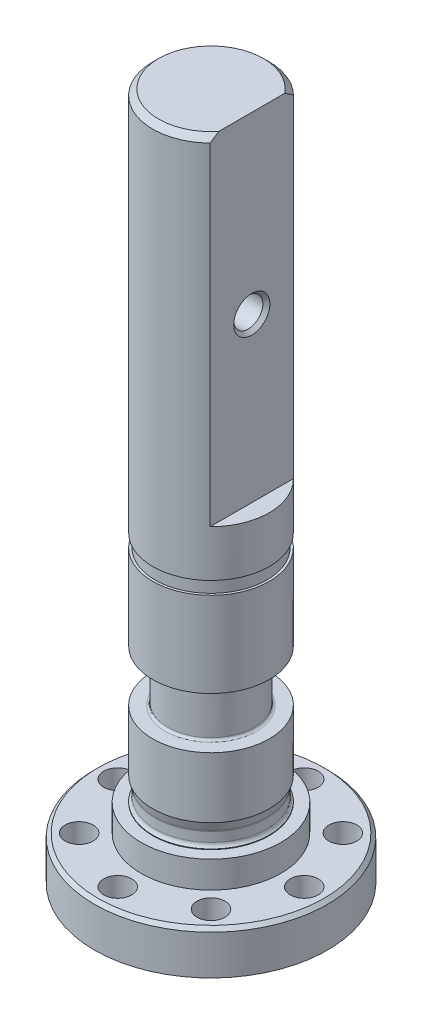
ISO-10303-21;
HEADER;
FILE_DESCRIPTION(('STEP AP214'),'2;1');
FILE_NAME('part.step','',(''),(''),'','','');
FILE_SCHEMA(('AUTOMOTIVE_DESIGN { 1 0 10303 214 1 1 1 1 }'));
ENDSEC;
DATA;
#1=APPLICATION_CONTEXT('core data for automotive mechanical design processes');
#2=APPLICATION_PROTOCOL_DEFINITION('international standard','automotive_design',2000,#1);
#3=PRODUCT_CONTEXT('',#1,'mechanical');
#4=PRODUCT('Part','Part','',(#3));
#5=PRODUCT_RELATED_PRODUCT_CATEGORY('part','',(#4));
#6=PRODUCT_DEFINITION_FORMATION('','',#4);
#7=PRODUCT_DEFINITION_CONTEXT('part definition',#1,'design');
#8=PRODUCT_DEFINITION('design','',#6,#7);
#9=PRODUCT_DEFINITION_SHAPE('','',#8);
#10=(LENGTH_UNIT() NAMED_UNIT(*) SI_UNIT(.MILLI.,.METRE.));
#11=(NAMED_UNIT(*) PLANE_ANGLE_UNIT() SI_UNIT($,.RADIAN.));
#12=(NAMED_UNIT(*) SI_UNIT($,.STERADIAN.) SOLID_ANGLE_UNIT());
#13=UNCERTAINTY_MEASURE_WITH_UNIT(LENGTH_MEASURE(1.E-05),#10,'distance_accuracy_value','');
#14=(GEOMETRIC_REPRESENTATION_CONTEXT(3) GLOBAL_UNCERTAINTY_ASSIGNED_CONTEXT((#13)) GLOBAL_UNIT_ASSIGNED_CONTEXT((#10,
#11,#12)) REPRESENTATION_CONTEXT('',''));
#15=CARTESIAN_POINT('',(0.,0.,0.));
#16=DIRECTION('',(0.,0.,1.));
#17=DIRECTION('',(1.,0.,0.));
#18=AXIS2_PLACEMENT_3D('',#15,#16,#17);
#19=CARTESIAN_POINT('',(0.,59.,0.));
#20=DIRECTION('',(0.,-1.,0.));
#21=DIRECTION('',(0.,0.,-1.));
#22=AXIS2_PLACEMENT_3D('',#19,#20,#21);
#23=CYLINDRICAL_SURFACE('',#22,5.);
#24=CARTESIAN_POINT('',(0.,17.6,0.));
#25=DIRECTION('',(0.,-1.,0.));
#26=DIRECTION('',(0.,0.,-1.));
#27=AXIS2_PLACEMENT_3D('',#24,#25,#26);
#28=CIRCLE('',#27,5.);
#29=CARTESIAN_POINT('',(0.,17.6,-5.));
#30=VERTEX_POINT('',#29);
#31=EDGE_CURVE('E93',#30,#30,#28,.T.);
#32=ORIENTED_EDGE('',*,*,#31,.F.);
#33=EDGE_LOOP('',(#32));
#34=FACE_BOUND('',#33,.T.);
#35=CARTESIAN_POINT('',(0.,24.9,0.));
#36=DIRECTION('',(0.,-1.,0.));
#37=DIRECTION('',(0.,0.,-1.));
#38=AXIS2_PLACEMENT_3D('',#35,#36,#37);
#39=CIRCLE('',#38,5.);
#40=CARTESIAN_POINT('',(0.,24.9,-5.));
#41=VERTEX_POINT('',#40);
#42=EDGE_CURVE('E644',#41,#41,#39,.T.);
#43=ORIENTED_EDGE('',*,*,#42,.T.);
#44=EDGE_LOOP('',(#43));
#45=FACE_BOUND('',#44,.T.);
#46=ADVANCED_FACE('F42',(#34,#45),#23,.T.);
#47=CARTESIAN_POINT('',(0.,8.,0.));
#48=DIRECTION('',(0.,-1.,0.));
#49=DIRECTION('',(0.,0.,-1.));
#50=AXIS2_PLACEMENT_3D('',#47,#48,#49);
#51=CIRCLE('',#50,5.);
#52=CARTESIAN_POINT('',(0.,8.,-5.));
#53=VERTEX_POINT('',#52);
#54=EDGE_CURVE('E119',#53,#53,#51,.T.);
#55=ORIENTED_EDGE('',*,*,#54,.F.);
#56=EDGE_LOOP('',(#55));
#57=FACE_BOUND('',#56,.T.);
#58=CARTESIAN_POINT('',(0.,13.2,0.));
#59=DIRECTION('',(0.,-1.,0.));
#60=DIRECTION('',(0.,0.,-1.));
#61=AXIS2_PLACEMENT_3D('',#58,#59,#60);
#62=CIRCLE('',#61,5.);
#63=CARTESIAN_POINT('',(0.,13.2,-5.));
#64=VERTEX_POINT('',#63);
#65=EDGE_CURVE('E88',#64,#64,#62,.T.);
#66=ORIENTED_EDGE('',*,*,#65,.T.);
#67=EDGE_LOOP('',(#66));
#68=FACE_BOUND('',#67,.T.);
#69=ADVANCED_FACE('F257',(#57,#68),#23,.T.);
#70=CARTESIAN_POINT('',(0.,6.,0.));
#71=DIRECTION('',(0.,1.,0.));
#72=DIRECTION('',(0.,0.,1.));
#73=AXIS2_PLACEMENT_3D('',#70,#71,#72);
#74=CIRCLE('',#73,5.);
#75=CARTESIAN_POINT('',(0.,6.,5.));
#76=VERTEX_POINT('',#75);
#77=EDGE_CURVE('E151',#76,#76,#74,.T.);
#78=ORIENTED_EDGE('',*,*,#77,.T.);
#79=EDGE_LOOP('',(#78));
#80=FACE_BOUND('',#79,.T.);
#81=CARTESIAN_POINT('',(0.,6.05358983848622,0.));
#82=DIRECTION('',(0.,1.,0.));
#83=DIRECTION('',(0.,0.,1.));
#84=AXIS2_PLACEMENT_3D('',#81,#82,#83);
#85=CIRCLE('',#84,5.);
#86=CARTESIAN_POINT('',(0.,6.05358983848622,5.));
#87=VERTEX_POINT('',#86);
#88=EDGE_CURVE('E122',#87,#87,#85,.T.);
#89=ORIENTED_EDGE('',*,*,#88,.F.);
#90=EDGE_LOOP('',(#89));
#91=FACE_BOUND('',#90,.T.);
#92=ADVANCED_FACE('F261',(#80,#91),#23,.T.);
#93=CARTESIAN_POINT('',(0.,6.,0.));
#94=DIRECTION('',(0.,1.,0.));
#95=DIRECTION('',(0.,0.,1.));
#96=AXIS2_PLACEMENT_3D('',#93,#94,#95);
#97=PLANE('',#96);
#98=CARTESIAN_POINT('',(0.,6.,0.));
#99=DIRECTION('',(0.,-1.,0.));
#100=DIRECTION('',(0.,0.,-1.));
#101=AXIS2_PLACEMENT_3D('',#98,#99,#100);
#102=CIRCLE('',#101,6.);
#103=CARTESIAN_POINT('',(0.,6.,-6.));
#104=VERTEX_POINT('',#103);
#105=EDGE_CURVE('E123',#104,#104,#102,.T.);
#106=ORIENTED_EDGE('',*,*,#105,.F.);
#107=EDGE_LOOP('',(#106));
#108=FACE_BOUND('',#107,.T.);
#109=ORIENTED_EDGE('',*,*,#77,.F.);
#110=EDGE_LOOP('',(#109));
#111=FACE_BOUND('',#110,.T.);
#112=ADVANCED_FACE('F250',(#108,#111),#97,.T.);
#113=CARTESIAN_POINT('',(-10.,3.7,0.));
#114=DIRECTION('',(0.,1.,0.));
#115=DIRECTION('',(0.,0.,1.));
#116=AXIS2_PLACEMENT_3D('',#113,#114,#115);
#117=PLANE('',#116);
#118=CARTESIAN_POINT('',(0.,3.7,0.));
#119=DIRECTION('',(0.,1.,0.));
#120=DIRECTION('',(0.,0.,1.));
#121=AXIS2_PLACEMENT_3D('',#118,#119,#120);
#122=CIRCLE('',#121,9.7);
#123=CARTESIAN_POINT('',(0.,3.7,9.7));
#124=VERTEX_POINT('',#123);
#125=EDGE_CURVE('E186',#124,#124,#122,.T.);
#126=ORIENTED_EDGE('',*,*,#125,.T.);
#127=EDGE_LOOP('',(#126));
#128=FACE_BOUND('',#127,.T.);
#129=CARTESIAN_POINT('',(0.,3.7,-8.));
#130=DIRECTION('',(0.,1.,0.));
#131=DIRECTION('',(0.,0.,1.));
#132=AXIS2_PLACEMENT_3D('',#129,#130,#131);
#133=CIRCLE('',#132,1.2);
#134=CARTESIAN_POINT('',(0.,3.7,-6.8));
#135=VERTEX_POINT('',#134);
#136=EDGE_CURVE('E148',#135,#135,#133,.T.);
#137=ORIENTED_EDGE('',*,*,#136,.F.);
#138=EDGE_LOOP('',(#137));
#139=FACE_BOUND('',#138,.T.);
#140=CARTESIAN_POINT('',(5.65685424949238,3.7,-5.65685424949238));
#141=DIRECTION('',(0.,1.,0.));
#142=DIRECTION('',(0.,0.,1.));
#143=AXIS2_PLACEMENT_3D('',#140,#141,#142);
#144=CIRCLE('',#143,1.2);
#145=CARTESIAN_POINT('',(5.65685424949238,3.7,-4.45685424949238));
#146=VERTEX_POINT('',#145);
#147=EDGE_CURVE('E145',#146,#146,#144,.T.);
#148=ORIENTED_EDGE('',*,*,#147,.F.);
#149=EDGE_LOOP('',(#148));
#150=FACE_BOUND('',#149,.T.);
#151=CARTESIAN_POINT('',(8.,3.7,0.));
#152=DIRECTION('',(0.,1.,0.));
#153=DIRECTION('',(0.,0.,1.));
#154=AXIS2_PLACEMENT_3D('',#151,#152,#153);
#155=CIRCLE('',#154,1.2);
#156=CARTESIAN_POINT('',(8.,3.7,1.2));
#157=VERTEX_POINT('',#156);
#158=EDGE_CURVE('E142',#157,#157,#155,.T.);
#159=ORIENTED_EDGE('',*,*,#158,.F.);
#160=EDGE_LOOP('',(#159));
#161=FACE_BOUND('',#160,.T.);
#162=CARTESIAN_POINT('',(5.65685424949238,3.7,5.65685424949238));
#163=DIRECTION('',(0.,1.,0.));
#164=DIRECTION('',(0.,0.,1.));
#165=AXIS2_PLACEMENT_3D('',#162,#163,#164);
#166=CIRCLE('',#165,1.2);
#167=CARTESIAN_POINT('',(5.65685424949238,3.7,6.85685424949238));
#168=VERTEX_POINT('',#167);
#169=EDGE_CURVE('E139',#168,#168,#166,.T.);
#170=ORIENTED_EDGE('',*,*,#169,.F.);
#171=EDGE_LOOP('',(#170));
#172=FACE_BOUND('',#171,.T.);
#173=CARTESIAN_POINT('',(0.,3.7,8.));
#174=DIRECTION('',(0.,1.,0.));
#175=DIRECTION('',(0.,0.,1.));
#176=AXIS2_PLACEMENT_3D('',#173,#174,#175);
#177=CIRCLE('',#176,1.2);
#178=CARTESIAN_POINT('',(0.,3.7,9.2));
#179=VERTEX_POINT('',#178);
#180=EDGE_CURVE('E136',#179,#179,#177,.T.);
#181=ORIENTED_EDGE('',*,*,#180,.F.);
#182=EDGE_LOOP('',(#181));
#183=FACE_BOUND('',#182,.T.);
#184=CARTESIAN_POINT('',(-5.65685424949238,3.7,5.65685424949238));
#185=DIRECTION('',(0.,1.,0.));
#186=DIRECTION('',(0.,0.,1.));
#187=AXIS2_PLACEMENT_3D('',#184,#185,#186);
#188=CIRCLE('',#187,1.2);
#189=CARTESIAN_POINT('',(-5.65685424949238,3.7,6.85685424949238));
#190=VERTEX_POINT('',#189);
#191=EDGE_CURVE('E133',#190,#190,#188,.T.);
#192=ORIENTED_EDGE('',*,*,#191,.F.);
#193=EDGE_LOOP('',(#192));
#194=FACE_BOUND('',#193,.T.);
#195=CARTESIAN_POINT('',(-8.,3.7,0.));
#196=DIRECTION('',(0.,1.,0.));
#197=DIRECTION('',(0.,0.,1.));
#198=AXIS2_PLACEMENT_3D('',#195,#196,#197);
#199=CIRCLE('',#198,1.2);
#200=CARTESIAN_POINT('',(-8.,3.7,1.2));
#201=VERTEX_POINT('',#200);
#202=EDGE_CURVE('E130',#201,#201,#199,.T.);
#203=ORIENTED_EDGE('',*,*,#202,.F.);
#204=EDGE_LOOP('',(#203));
#205=FACE_BOUND('',#204,.T.);
#206=CARTESIAN_POINT('',(-5.65685424949238,3.7,-5.65685424949238));
#207=DIRECTION('',(0.,1.,0.));
#208=DIRECTION('',(0.,0.,1.));
#209=AXIS2_PLACEMENT_3D('',#206,#207,#208);
#210=CIRCLE('',#209,1.2);
#211=CARTESIAN_POINT('',(-5.65685424949238,3.7,-4.45685424949238));
#212=VERTEX_POINT('',#211);
#213=EDGE_CURVE('E129',#212,#212,#210,.T.);
#214=ORIENTED_EDGE('',*,*,#213,.F.);
#215=EDGE_LOOP('',(#214));
#216=FACE_BOUND('',#215,.T.);
#217=CARTESIAN_POINT('',(0.,3.7,0.));
#218=DIRECTION('',(0.,-1.,0.));
#219=DIRECTION('',(0.,0.,-1.));
#220=AXIS2_PLACEMENT_3D('',#217,#218,#219);
#221=CIRCLE('',#220,6.);
#222=CARTESIAN_POINT('',(0.,3.7,-6.));
#223=VERTEX_POINT('',#222);
#224=EDGE_CURVE('E126',#223,#223,#221,.T.);
#225=ORIENTED_EDGE('',*,*,#224,.T.);
#226=EDGE_LOOP('',(#225));
#227=FACE_BOUND('',#226,.T.);
#228=ADVANCED_FACE('F246',(#128,#139,#150,#161,#172,#183,#194,#205,#216,#227),#117,.T.);
#229=CARTESIAN_POINT('',(0.,0.,0.));
#230=DIRECTION('',(0.,-1.,0.));
#231=DIRECTION('',(0.,0.,-1.));
#232=AXIS2_PLACEMENT_3D('',#229,#230,#231);
#233=CYLINDRICAL_SURFACE('',#232,6.);
#234=ORIENTED_EDGE('',*,*,#105,.T.);
#235=EDGE_LOOP('',(#234));
#236=FACE_BOUND('',#235,.T.);
#237=ORIENTED_EDGE('',*,*,#224,.F.);
#238=EDGE_LOOP('',(#237));
#239=FACE_BOUND('',#238,.T.);
#240=ADVANCED_FACE('F242',(#236,#239),#233,.T.);
#241=CARTESIAN_POINT('',(-5.65685424949238,6.,5.65685424949238));
#242=DIRECTION('',(0.,-1.,0.));
#243=DIRECTION('',(0.,0.,-1.));
#244=AXIS2_PLACEMENT_3D('',#241,#242,#243);
#245=CYLINDRICAL_SURFACE('',#244,1.2);
#246=CARTESIAN_POINT('',(-5.65685424949238,0.,5.65685424949238));
#247=DIRECTION('',(0.,1.,0.));
#248=DIRECTION('',(0.,0.,1.));
#249=AXIS2_PLACEMENT_3D('',#246,#247,#248);
#250=CIRCLE('',#249,1.2);
#251=CARTESIAN_POINT('',(-5.65685424949238,0.,6.85685424949238));
#252=VERTEX_POINT('',#251);
#253=EDGE_CURVE('E160',#252,#252,#250,.T.);
#254=ORIENTED_EDGE('',*,*,#253,.F.);
#255=EDGE_LOOP('',(#254));
#256=FACE_BOUND('',#255,.T.);
#257=ORIENTED_EDGE('',*,*,#191,.T.);
#258=EDGE_LOOP('',(#257));
#259=FACE_BOUND('',#258,.T.);
#260=ADVANCED_FACE('F245',(#256,#259),#245,.F.);
#261=CARTESIAN_POINT('',(5.65685424949238,6.,5.65685424949238));
#262=DIRECTION('',(0.,-1.,0.));
#263=DIRECTION('',(0.,0.,-1.));
#264=AXIS2_PLACEMENT_3D('',#261,#262,#263);
#265=CYLINDRICAL_SURFACE('',#264,1.2);
#266=CARTESIAN_POINT('',(5.65685424949238,0.,5.65685424949238));
#267=DIRECTION('',(0.,1.,0.));
#268=DIRECTION('',(0.,0.,1.));
#269=AXIS2_PLACEMENT_3D('',#266,#267,#268);
#270=CIRCLE('',#269,1.2);
#271=CARTESIAN_POINT('',(5.65685424949238,0.,6.85685424949238));
#272=VERTEX_POINT('',#271);
#273=EDGE_CURVE('E166',#272,#272,#270,.T.);
#274=ORIENTED_EDGE('',*,*,#273,.F.);
#275=EDGE_LOOP('',(#274));
#276=FACE_BOUND('',#275,.T.);
#277=ORIENTED_EDGE('',*,*,#169,.T.);
#278=EDGE_LOOP('',(#277));
#279=FACE_BOUND('',#278,.T.);
#280=ADVANCED_FACE('F275',(#276,#279),#265,.F.);
#281=CARTESIAN_POINT('',(5.65685424949238,6.,-5.65685424949238));
#282=DIRECTION('',(0.,-1.,0.));
#283=DIRECTION('',(0.,0.,-1.));
#284=AXIS2_PLACEMENT_3D('',#281,#282,#283);
#285=CYLINDRICAL_SURFACE('',#284,1.2);
#286=CARTESIAN_POINT('',(5.65685424949238,0.,-5.65685424949238));
#287=DIRECTION('',(0.,1.,0.));
#288=DIRECTION('',(0.,0.,1.));
#289=AXIS2_PLACEMENT_3D('',#286,#287,#288);
#290=CIRCLE('',#289,1.2);
#291=CARTESIAN_POINT('',(5.65685424949238,0.,-4.45685424949238));
#292=VERTEX_POINT('',#291);
#293=EDGE_CURVE('E172',#292,#292,#290,.T.);
#294=ORIENTED_EDGE('',*,*,#293,.F.);
#295=EDGE_LOOP('',(#294));
#296=FACE_BOUND('',#295,.T.);
#297=ORIENTED_EDGE('',*,*,#147,.T.);
#298=EDGE_LOOP('',(#297));
#299=FACE_BOUND('',#298,.T.);
#300=ADVANCED_FACE('F283',(#296,#299),#285,.F.);
#301=CARTESIAN_POINT('',(0.,6.,0.));
#302=DIRECTION('',(0.,-1.,0.));
#303=DIRECTION('',(0.,0.,-1.));
#304=AXIS2_PLACEMENT_3D('',#301,#302,#303);
#305=CYLINDRICAL_SURFACE('',#304,10.);
#306=CARTESIAN_POINT('',(0.,3.4,0.));
#307=DIRECTION('',(0.,1.,0.));
#308=DIRECTION('',(0.,0.,1.));
#309=AXIS2_PLACEMENT_3D('',#306,#307,#308);
#310=CIRCLE('',#309,10.);
#311=CARTESIAN_POINT('',(0.,3.4,10.));
#312=VERTEX_POINT('',#311);
#313=EDGE_CURVE('E181',#312,#312,#310,.F.);
#314=ORIENTED_EDGE('',*,*,#313,.T.);
#315=EDGE_LOOP('',(#314));
#316=FACE_BOUND('',#315,.T.);
#317=CARTESIAN_POINT('',(0.,0.,0.));
#318=DIRECTION('',(0.,1.,0.));
#319=DIRECTION('',(0.,0.,1.));
#320=AXIS2_PLACEMENT_3D('',#317,#318,#319);
#321=CIRCLE('',#320,10.);
#322=CARTESIAN_POINT('',(0.,0.,10.));
#323=VERTEX_POINT('',#322);
#324=EDGE_CURVE('E178',#323,#323,#321,.T.);
#325=ORIENTED_EDGE('',*,*,#324,.T.);
#326=EDGE_LOOP('',(#325));
#327=FACE_BOUND('',#326,.T.);
#328=ADVANCED_FACE('F291',(#316,#327),#305,.T.);
#329=CARTESIAN_POINT('',(0.,6.,-8.));
#330=DIRECTION('',(0.,-1.,0.));
#331=DIRECTION('',(0.,0.,-1.));
#332=AXIS2_PLACEMENT_3D('',#329,#330,#331);
#333=CYLINDRICAL_SURFACE('',#332,1.2);
#334=CARTESIAN_POINT('',(0.,0.,-8.));
#335=DIRECTION('',(0.,1.,0.));
#336=DIRECTION('',(0.,0.,1.));
#337=AXIS2_PLACEMENT_3D('',#334,#335,#336);
#338=CIRCLE('',#337,1.2);
#339=CARTESIAN_POINT('',(0.,0.,-6.8));
#340=VERTEX_POINT('',#339);
#341=EDGE_CURVE('E175',#340,#340,#338,.T.);
#342=ORIENTED_EDGE('',*,*,#341,.F.);
#343=EDGE_LOOP('',(#342));
#344=FACE_BOUND('',#343,.T.);
#345=ORIENTED_EDGE('',*,*,#136,.T.);
#346=EDGE_LOOP('',(#345));
#347=FACE_BOUND('',#346,.T.);
#348=ADVANCED_FACE('F287',(#344,#347),#333,.F.);
#349=CARTESIAN_POINT('',(8.,6.,0.));
#350=DIRECTION('',(0.,-1.,0.));
#351=DIRECTION('',(0.,0.,-1.));
#352=AXIS2_PLACEMENT_3D('',#349,#350,#351);
#353=CYLINDRICAL_SURFACE('',#352,1.2);
#354=CARTESIAN_POINT('',(8.,0.,0.));
#355=DIRECTION('',(0.,1.,0.));
#356=DIRECTION('',(0.,0.,1.));
#357=AXIS2_PLACEMENT_3D('',#354,#355,#356);
#358=CIRCLE('',#357,1.2);
#359=CARTESIAN_POINT('',(8.,0.,1.2));
#360=VERTEX_POINT('',#359);
#361=EDGE_CURVE('E169',#360,#360,#358,.T.);
#362=ORIENTED_EDGE('',*,*,#361,.F.);
#363=EDGE_LOOP('',(#362));
#364=FACE_BOUND('',#363,.T.);
#365=ORIENTED_EDGE('',*,*,#158,.T.);
#366=EDGE_LOOP('',(#365));
#367=FACE_BOUND('',#366,.T.);
#368=ADVANCED_FACE('F279',(#364,#367),#353,.F.);
#369=CARTESIAN_POINT('',(0.,6.,8.));
#370=DIRECTION('',(0.,-1.,0.));
#371=DIRECTION('',(0.,0.,-1.));
#372=AXIS2_PLACEMENT_3D('',#369,#370,#371);
#373=CYLINDRICAL_SURFACE('',#372,1.2);
#374=CARTESIAN_POINT('',(0.,0.,8.));
#375=DIRECTION('',(0.,1.,0.));
#376=DIRECTION('',(0.,0.,1.));
#377=AXIS2_PLACEMENT_3D('',#374,#375,#376);
#378=CIRCLE('',#377,1.2);
#379=CARTESIAN_POINT('',(0.,0.,9.2));
#380=VERTEX_POINT('',#379);
#381=EDGE_CURVE('E163',#380,#380,#378,.T.);
#382=ORIENTED_EDGE('',*,*,#381,.F.);
#383=EDGE_LOOP('',(#382));
#384=FACE_BOUND('',#383,.T.);
#385=ORIENTED_EDGE('',*,*,#180,.T.);
#386=EDGE_LOOP('',(#385));
#387=FACE_BOUND('',#386,.T.);
#388=ADVANCED_FACE('F271',(#384,#387),#373,.F.);
#389=CARTESIAN_POINT('',(-8.,6.,0.));
#390=DIRECTION('',(0.,-1.,0.));
#391=DIRECTION('',(0.,0.,-1.));
#392=AXIS2_PLACEMENT_3D('',#389,#390,#391);
#393=CYLINDRICAL_SURFACE('',#392,1.2);
#394=CARTESIAN_POINT('',(-8.,0.,0.));
#395=DIRECTION('',(0.,1.,0.));
#396=DIRECTION('',(0.,0.,1.));
#397=AXIS2_PLACEMENT_3D('',#394,#395,#396);
#398=CIRCLE('',#397,1.2);
#399=CARTESIAN_POINT('',(-8.,0.,1.2));
#400=VERTEX_POINT('',#399);
#401=EDGE_CURVE('E157',#400,#400,#398,.T.);
#402=ORIENTED_EDGE('',*,*,#401,.F.);
#403=EDGE_LOOP('',(#402));
#404=FACE_BOUND('',#403,.T.);
#405=ORIENTED_EDGE('',*,*,#202,.T.);
#406=EDGE_LOOP('',(#405));
#407=FACE_BOUND('',#406,.T.);
#408=ADVANCED_FACE('F268',(#404,#407),#393,.F.);
#409=CARTESIAN_POINT('',(0.,0.,0.));
#410=DIRECTION('',(0.,1.,0.));
#411=DIRECTION('',(0.,0.,1.));
#412=AXIS2_PLACEMENT_3D('',#409,#410,#411);
#413=PLANE('',#412);
#414=CARTESIAN_POINT('',(0.,0.,0.));
#415=DIRECTION('',(0.,-1.,0.));
#416=DIRECTION('',(0.,0.,-1.));
#417=AXIS2_PLACEMENT_3D('',#414,#415,#416);
#418=CIRCLE('',#417,4.05);
#419=CARTESIAN_POINT('',(0.,0.,-4.05));
#420=VERTEX_POINT('',#419);
#421=EDGE_CURVE('E107',#420,#420,#418,.T.);
#422=ORIENTED_EDGE('',*,*,#421,.F.);
#423=EDGE_LOOP('',(#422));
#424=FACE_BOUND('',#423,.T.);
#425=ORIENTED_EDGE('',*,*,#401,.T.);
#426=EDGE_LOOP('',(#425));
#427=FACE_BOUND('',#426,.T.);
#428=ORIENTED_EDGE('',*,*,#381,.T.);
#429=EDGE_LOOP('',(#428));
#430=FACE_BOUND('',#429,.T.);
#431=ORIENTED_EDGE('',*,*,#361,.T.);
#432=EDGE_LOOP('',(#431));
#433=FACE_BOUND('',#432,.T.);
#434=ORIENTED_EDGE('',*,*,#341,.T.);
#435=EDGE_LOOP('',(#434));
#436=FACE_BOUND('',#435,.T.);
#437=ORIENTED_EDGE('',*,*,#324,.F.);
#438=EDGE_LOOP('',(#437));
#439=FACE_BOUND('',#438,.T.);
#440=ORIENTED_EDGE('',*,*,#293,.T.);
#441=EDGE_LOOP('',(#440));
#442=FACE_BOUND('',#441,.T.);
#443=ORIENTED_EDGE('',*,*,#273,.T.);
#444=EDGE_LOOP('',(#443));
#445=FACE_BOUND('',#444,.T.);
#446=ORIENTED_EDGE('',*,*,#253,.T.);
#447=EDGE_LOOP('',(#446));
#448=FACE_BOUND('',#447,.T.);
#449=CARTESIAN_POINT('',(-5.65685424949238,0.,-5.65685424949238));
#450=DIRECTION('',(0.,1.,0.));
#451=DIRECTION('',(0.,0.,1.));
#452=AXIS2_PLACEMENT_3D('',#449,#450,#451);
#453=CIRCLE('',#452,1.2);
#454=CARTESIAN_POINT('',(-5.65685424949238,0.,-4.45685424949238));
#455=VERTEX_POINT('',#454);
#456=EDGE_CURVE('E154',#455,#455,#453,.T.);
#457=ORIENTED_EDGE('',*,*,#456,.T.);
#458=EDGE_LOOP('',(#457));
#459=FACE_BOUND('',#458,.T.);
#460=ADVANCED_FACE('F266',(#424,#427,#430,#433,#436,#439,#442,#445,#448,#459),#413,.F.);
#461=CARTESIAN_POINT('',(-5.65685424949238,6.,-5.65685424949238));
#462=DIRECTION('',(0.,-1.,0.));
#463=DIRECTION('',(0.,0.,-1.));
#464=AXIS2_PLACEMENT_3D('',#461,#462,#463);
#465=CYLINDRICAL_SURFACE('',#464,1.2);
#466=ORIENTED_EDGE('',*,*,#456,.F.);
#467=EDGE_LOOP('',(#466));
#468=FACE_BOUND('',#467,.T.);
#469=ORIENTED_EDGE('',*,*,#213,.T.);
#470=EDGE_LOOP('',(#469));
#471=FACE_BOUND('',#470,.T.);
#472=ADVANCED_FACE('F263',(#468,#471),#465,.F.);
#473=CARTESIAN_POINT('',(0.,3.4,0.));
#474=DIRECTION('',(0.,-1.,0.));
#475=DIRECTION('',(0.,0.,-1.));
#476=AXIS2_PLACEMENT_3D('',#473,#474,#475);
#477=CONICAL_SURFACE('',#476,10.,0.785398163397451);
#478=ORIENTED_EDGE('',*,*,#125,.F.);
#479=EDGE_LOOP('',(#478));
#480=FACE_BOUND('',#479,.T.);
#481=ORIENTED_EDGE('',*,*,#313,.F.);
#482=EDGE_LOOP('',(#481));
#483=FACE_BOUND('',#482,.T.);
#484=ADVANCED_FACE('F230',(#480,#483),#477,.T.);
#485=CARTESIAN_POINT('',(0.,6.4,0.));
#486=DIRECTION('',(0.,-1.,0.));
#487=DIRECTION('',(0.,0.,-1.));
#488=AXIS2_PLACEMENT_3D('',#485,#486,#487);
#489=TOROIDAL_SURFACE('',#488,5.2,0.400000000000001);
#490=CARTESIAN_POINT('',(0.,6.4,0.));
#491=DIRECTION('',(0.,-1.,0.));
#492=DIRECTION('',(0.,0.,-1.));
#493=AXIS2_PLACEMENT_3D('',#490,#491,#492);
#494=CIRCLE('',#493,4.8);
#495=CARTESIAN_POINT('',(0.,6.4,-4.8));
#496=VERTEX_POINT('',#495);
#497=EDGE_CURVE('E110',#496,#496,#494,.T.);
#498=ORIENTED_EDGE('',*,*,#497,.T.);
#499=EDGE_LOOP('',(#498));
#500=FACE_BOUND('',#499,.T.);
#501=ORIENTED_EDGE('',*,*,#88,.T.);
#502=EDGE_LOOP('',(#501));
#503=FACE_BOUND('',#502,.T.);
#504=ADVANCED_FACE('F226',(#500,#503),#489,.F.);
#505=CARTESIAN_POINT('',(0.,7.30445645749228,0.));
#506=DIRECTION('',(0.,1.,0.));
#507=DIRECTION('',(0.,0.,1.));
#508=AXIS2_PLACEMENT_3D('',#505,#506,#507);
#509=CONICAL_SURFACE('',#508,4.81362966948437,0.261799387799151);
#510=ORIENTED_EDGE('',*,*,#54,.T.);
#511=EDGE_LOOP('',(#510));
#512=FACE_BOUND('',#511,.T.);
#513=CARTESIAN_POINT('',(0.,7.30445645749228,0.));
#514=DIRECTION('',(0.,-1.,0.));
#515=DIRECTION('',(0.,0.,-1.));
#516=AXIS2_PLACEMENT_3D('',#513,#514,#515);
#517=CIRCLE('',#516,4.81362966948437);
#518=CARTESIAN_POINT('',(0.,7.30445645749228,-4.81362966948437));
#519=VERTEX_POINT('',#518);
#520=EDGE_CURVE('E116',#519,#519,#517,.T.);
#521=ORIENTED_EDGE('',*,*,#520,.F.);
#522=EDGE_LOOP('',(#521));
#523=FACE_BOUND('',#522,.T.);
#524=ADVANCED_FACE('F229',(#512,#523),#509,.T.);
#525=CARTESIAN_POINT('',(0.,7.20092883945127,0.));
#526=DIRECTION('',(0.,-1.,0.));
#527=DIRECTION('',(0.,0.,-1.));
#528=AXIS2_PLACEMENT_3D('',#525,#526,#527);
#529=TOROIDAL_SURFACE('',#528,5.2,0.4);
#530=ORIENTED_EDGE('',*,*,#520,.T.);
#531=EDGE_LOOP('',(#530));
#532=FACE_BOUND('',#531,.T.);
#533=CARTESIAN_POINT('',(0.,7.20092883945127,0.));
#534=DIRECTION('',(0.,-1.,0.));
#535=DIRECTION('',(0.,0.,-1.));
#536=AXIS2_PLACEMENT_3D('',#533,#534,#535);
#537=CIRCLE('',#536,4.8);
#538=CARTESIAN_POINT('',(0.,7.20092883945127,-4.8));
#539=VERTEX_POINT('',#538);
#540=EDGE_CURVE('E113',#539,#539,#537,.T.);
#541=ORIENTED_EDGE('',*,*,#540,.F.);
#542=EDGE_LOOP('',(#541));
#543=FACE_BOUND('',#542,.T.);
#544=ADVANCED_FACE('F234',(#532,#543),#529,.F.);
#545=CARTESIAN_POINT('',(0.,0.,0.));
#546=DIRECTION('',(0.,-1.,0.));
#547=DIRECTION('',(0.,0.,-1.));
#548=AXIS2_PLACEMENT_3D('',#545,#546,#547);
#549=CYLINDRICAL_SURFACE('',#548,4.8);
#550=ORIENTED_EDGE('',*,*,#540,.T.);
#551=EDGE_LOOP('',(#550));
#552=FACE_BOUND('',#551,.T.);
#553=ORIENTED_EDGE('',*,*,#497,.F.);
#554=EDGE_LOOP('',(#553));
#555=FACE_BOUND('',#554,.T.);
#556=ADVANCED_FACE('F224',(#552,#555),#549,.T.);
#557=CARTESIAN_POINT('',(0.,0.,0.));
#558=DIRECTION('',(0.,-1.,0.));
#559=DIRECTION('',(0.,0.,-1.));
#560=AXIS2_PLACEMENT_3D('',#557,#558,#559);
#561=CYLINDRICAL_SURFACE('',#560,4.05);
#562=ORIENTED_EDGE('',*,*,#421,.T.);
#563=EDGE_LOOP('',(#562));
#564=FACE_BOUND('',#563,.T.);
#565=CARTESIAN_POINT('',(0.,2.5,0.));
#566=DIRECTION('',(0.,-1.,0.));
#567=DIRECTION('',(0.,0.,-1.));
#568=AXIS2_PLACEMENT_3D('',#565,#566,#567);
#569=CIRCLE('',#568,4.05);
#570=CARTESIAN_POINT('',(0.,2.5,-4.05));
#571=VERTEX_POINT('',#570);
#572=EDGE_CURVE('E85',#571,#571,#569,.T.);
#573=ORIENTED_EDGE('',*,*,#572,.F.);
#574=EDGE_LOOP('',(#573));
#575=FACE_BOUND('',#574,.T.);
#576=ADVANCED_FACE('F81',(#564,#575),#561,.F.);
#577=CARTESIAN_POINT('',(0.,2.5,0.));
#578=DIRECTION('',(0.,-1.,0.));
#579=DIRECTION('',(0.,0.,-1.));
#580=AXIS2_PLACEMENT_3D('',#577,#578,#579);
#581=CONICAL_SURFACE('',#580,4.05,1.02974425867665);
#582=CARTESIAN_POINT('',(0.,4.93348550706162,0.));
#583=VERTEX_POINT('',#582);
#584=VERTEX_LOOP('',#583);
#585=FACE_BOUND('',#584,.T.);
#586=ORIENTED_EDGE('',*,*,#572,.T.);
#587=EDGE_LOOP('',(#586));
#588=FACE_BOUND('',#587,.T.);
#589=ADVANCED_FACE('F77',(#585,#588),#581,.F.);
#590=CARTESIAN_POINT('',(-5.,13.2,0.));
#591=DIRECTION('',(0.,1.,0.));
#592=DIRECTION('',(0.,0.,1.));
#593=AXIS2_PLACEMENT_3D('',#590,#591,#592);
#594=PLANE('',#593);
#595=CARTESIAN_POINT('',(0.,13.2,0.));
#596=DIRECTION('',(0.,1.,0.));
#597=DIRECTION('',(0.,0.,1.));
#598=AXIS2_PLACEMENT_3D('',#595,#596,#597);
#599=CIRCLE('',#598,3.9);
#600=CARTESIAN_POINT('',(0.,13.2,3.9));
#601=VERTEX_POINT('',#600);
#602=EDGE_CURVE('E662',#601,#601,#599,.F.);
#603=ORIENTED_EDGE('',*,*,#602,.T.);
#604=EDGE_LOOP('',(#603));
#605=FACE_BOUND('',#604,.T.);
#606=ORIENTED_EDGE('',*,*,#65,.F.);
#607=EDGE_LOOP('',(#606));
#608=FACE_BOUND('',#607,.T.);
#609=ADVANCED_FACE('F80',(#605,#608),#594,.T.);
#610=CARTESIAN_POINT('',(0.,0.,0.));
#611=DIRECTION('',(0.,-1.,0.));
#612=DIRECTION('',(0.,0.,-1.));
#613=AXIS2_PLACEMENT_3D('',#610,#611,#612);
#614=CYLINDRICAL_SURFACE('',#613,3.7);
#615=CARTESIAN_POINT('',(0.,13.4,0.));
#616=DIRECTION('',(0.,1.,0.));
#617=DIRECTION('',(0.,0.,1.));
#618=AXIS2_PLACEMENT_3D('',#615,#616,#617);
#619=CIRCLE('',#618,3.7);
#620=CARTESIAN_POINT('',(0.,13.4,3.7));
#621=VERTEX_POINT('',#620);
#622=EDGE_CURVE('E50',#621,#621,#619,.T.);
#623=ORIENTED_EDGE('',*,*,#622,.T.);
#624=EDGE_LOOP('',(#623));
#625=FACE_BOUND('',#624,.T.);
#626=CARTESIAN_POINT('',(0.,17.4,0.));
#627=DIRECTION('',(0.,-1.,0.));
#628=DIRECTION('',(0.,0.,-1.));
#629=AXIS2_PLACEMENT_3D('',#626,#627,#628);
#630=CIRCLE('',#629,3.7);
#631=CARTESIAN_POINT('',(0.,17.4,-3.7));
#632=VERTEX_POINT('',#631);
#633=EDGE_CURVE('E660',#632,#632,#630,.T.);
#634=ORIENTED_EDGE('',*,*,#633,.T.);
#635=EDGE_LOOP('',(#634));
#636=FACE_BOUND('',#635,.T.);
#637=ADVANCED_FACE('F531',(#625,#636),#614,.T.);
#638=CARTESIAN_POINT('',(-5.,17.6,0.));
#639=DIRECTION('',(0.,-1.,0.));
#640=DIRECTION('',(0.,0.,-1.));
#641=AXIS2_PLACEMENT_3D('',#638,#639,#640);
#642=PLANE('',#641);
#643=CARTESIAN_POINT('',(0.,17.6,0.));
#644=DIRECTION('',(0.,-1.,0.));
#645=DIRECTION('',(0.,0.,-1.));
#646=AXIS2_PLACEMENT_3D('',#643,#644,#645);
#647=CIRCLE('',#646,3.9);
#648=CARTESIAN_POINT('',(0.,17.6,-3.9));
#649=VERTEX_POINT('',#648);
#650=EDGE_CURVE('E14',#649,#649,#647,.F.);
#651=ORIENTED_EDGE('',*,*,#650,.T.);
#652=EDGE_LOOP('',(#651));
#653=FACE_BOUND('',#652,.T.);
#654=ORIENTED_EDGE('',*,*,#31,.T.);
#655=EDGE_LOOP('',(#654));
#656=FACE_BOUND('',#655,.T.);
#657=ADVANCED_FACE('F542',(#653,#656),#642,.T.);
#658=CARTESIAN_POINT('',(0.,13.4,0.));
#659=DIRECTION('',(0.,1.,0.));
#660=DIRECTION('',(0.,0.,1.));
#661=AXIS2_PLACEMENT_3D('',#658,#659,#660);
#662=TOROIDAL_SURFACE('',#661,3.9,0.2);
#663=ORIENTED_EDGE('',*,*,#622,.F.);
#664=EDGE_LOOP('',(#663));
#665=FACE_BOUND('',#664,.T.);
#666=ORIENTED_EDGE('',*,*,#602,.F.);
#667=EDGE_LOOP('',(#666));
#668=FACE_BOUND('',#667,.T.);
#669=ADVANCED_FACE('F553',(#665,#668),#662,.F.);
#670=CARTESIAN_POINT('',(0.,17.4,0.));
#671=DIRECTION('',(0.,-1.,0.));
#672=DIRECTION('',(0.,0.,-1.));
#673=AXIS2_PLACEMENT_3D('',#670,#671,#672);
#674=TOROIDAL_SURFACE('',#673,3.9,0.2);
#675=ORIENTED_EDGE('',*,*,#650,.F.);
#676=EDGE_LOOP('',(#675));
#677=FACE_BOUND('',#676,.T.);
#678=ORIENTED_EDGE('',*,*,#633,.F.);
#679=EDGE_LOOP('',(#678));
#680=FACE_BOUND('',#679,.T.);
#681=ADVANCED_FACE('F44',(#677,#680),#674,.F.);
#682=CARTESIAN_POINT('',(-5.,24.9,0.));
#683=DIRECTION('',(0.,1.,0.));
#684=DIRECTION('',(0.,0.,1.));
#685=AXIS2_PLACEMENT_3D('',#682,#683,#684);
#686=PLANE('',#685);
#687=CARTESIAN_POINT('',(0.,24.9,0.));
#688=DIRECTION('',(0.,-1.,0.));
#689=DIRECTION('',(0.,0.,-1.));
#690=AXIS2_PLACEMENT_3D('',#687,#688,#689);
#691=CIRCLE('',#690,4.8);
#692=CARTESIAN_POINT('',(0.,24.9,-4.8));
#693=VERTEX_POINT('',#692);
#694=EDGE_CURVE('E641',#693,#693,#691,.T.);
#695=ORIENTED_EDGE('',*,*,#694,.T.);
#696=EDGE_LOOP('',(#695));
#697=FACE_BOUND('',#696,.T.);
#698=ORIENTED_EDGE('',*,*,#42,.F.);
#699=EDGE_LOOP('',(#698));
#700=FACE_BOUND('',#699,.T.);
#701=ADVANCED_FACE('F572',(#697,#700),#686,.T.);
#702=CARTESIAN_POINT('',(0.,0.,0.));
#703=DIRECTION('',(0.,-1.,0.));
#704=DIRECTION('',(0.,0.,-1.));
#705=AXIS2_PLACEMENT_3D('',#702,#703,#704);
#706=CYLINDRICAL_SURFACE('',#705,4.8);
#707=CARTESIAN_POINT('',(0.,26.,0.));
#708=DIRECTION('',(0.,-1.,0.));
#709=DIRECTION('',(0.,0.,-1.));
#710=AXIS2_PLACEMENT_3D('',#707,#708,#709);
#711=CIRCLE('',#710,4.8);
#712=CARTESIAN_POINT('',(0.,26.,-4.8));
#713=VERTEX_POINT('',#712);
#714=EDGE_CURVE('E640',#713,#713,#711,.T.);
#715=ORIENTED_EDGE('',*,*,#714,.T.);
#716=EDGE_LOOP('',(#715));
#717=FACE_BOUND('',#716,.T.);
#718=ORIENTED_EDGE('',*,*,#694,.F.);
#719=EDGE_LOOP('',(#718));
#720=FACE_BOUND('',#719,.T.);
#721=ADVANCED_FACE('F590',(#717,#720),#706,.T.);
#722=CARTESIAN_POINT('',(-5.,26.,0.));
#723=DIRECTION('',(0.,-1.,0.));
#724=DIRECTION('',(0.,0.,-1.));
#725=AXIS2_PLACEMENT_3D('',#722,#723,#724);
#726=PLANE('',#725);
#727=CARTESIAN_POINT('',(0.,26.,0.));
#728=DIRECTION('',(0.,-1.,0.));
#729=DIRECTION('',(0.,0.,-1.));
#730=AXIS2_PLACEMENT_3D('',#727,#728,#729);
#731=CIRCLE('',#730,5.);
#732=CARTESIAN_POINT('',(0.,26.,-5.));
#733=VERTEX_POINT('',#732);
#734=EDGE_CURVE('E637',#733,#733,#731,.T.);
#735=ORIENTED_EDGE('',*,*,#734,.T.);
#736=EDGE_LOOP('',(#735));
#737=FACE_BOUND('',#736,.T.);
#738=ORIENTED_EDGE('',*,*,#714,.F.);
#739=EDGE_LOOP('',(#738));
#740=FACE_BOUND('',#739,.T.);
#741=ADVANCED_FACE('F255',(#737,#740),#726,.T.);
#742=CARTESIAN_POINT('',(0.,59.,0.));
#743=DIRECTION('',(0.,1.,0.));
#744=DIRECTION('',(0.,0.,1.));
#745=AXIS2_PLACEMENT_3D('',#742,#743,#744);
#746=PLANE('',#745);
#747=DIRECTION('',(0.,0.,1.));
#748=VECTOR('',#747,1.);
#749=CARTESIAN_POINT('',(3.5,59.,3.57071421427143));
#750=LINE('',#749,#748);
#751=CARTESIAN_POINT('',(3.5,59.,-2.82842712474619));
#752=VERTEX_POINT('',#751);
#753=CARTESIAN_POINT('',(3.5,59.,2.82842712474619));
#754=VERTEX_POINT('',#753);
#755=EDGE_CURVE('E57',#752,#754,#750,.T.);
#756=ORIENTED_EDGE('',*,*,#755,.F.);
#757=CARTESIAN_POINT('',(0.,59.,0.));
#758=DIRECTION('',(0.,1.,0.));
#759=DIRECTION('',(0.,0.,1.));
#760=AXIS2_PLACEMENT_3D('',#757,#758,#759);
#761=CIRCLE('',#760,4.5);
#762=EDGE_CURVE('E189',#752,#754,#761,.T.);
#763=ORIENTED_EDGE('',*,*,#762,.T.);
#764=EDGE_LOOP('',(#756,#763));
#765=FACE_BOUND('',#764,.T.);
#766=ADVANCED_FACE('F252',(#765),#746,.T.);
#767=CARTESIAN_POINT('',(3.19999999999999,44.,0.));
#768=DIRECTION('',(1.,0.,0.));
#769=DIRECTION('',(0.,0.,-1.));
#770=AXIS2_PLACEMENT_3D('',#767,#768,#769);
#771=CONICAL_SURFACE('',#770,1.25,0.785398163397444);
#772=CARTESIAN_POINT('',(3.5,44.,0.));
#773=DIRECTION('',(-1.,0.,0.));
#774=DIRECTION('',(0.,0.,1.));
#775=AXIS2_PLACEMENT_3D('',#772,#773,#774);
#776=CIRCLE('',#775,1.55000000000001);
#777=CARTESIAN_POINT('',(3.5,44.,1.55000000000001));
#778=VERTEX_POINT('',#777);
#779=EDGE_CURVE('E666',#778,#778,#776,.T.);
#780=ORIENTED_EDGE('',*,*,#779,.F.);
#781=EDGE_LOOP('',(#780));
#782=FACE_BOUND('',#781,.T.);
#783=CARTESIAN_POINT('',(3.19999999999999,44.,0.));
#784=DIRECTION('',(-1.,0.,0.));
#785=DIRECTION('',(0.,0.,1.));
#786=AXIS2_PLACEMENT_3D('',#783,#784,#785);
#787=CIRCLE('',#786,1.25);
#788=CARTESIAN_POINT('',(3.19999999999999,44.,1.25));
#789=VERTEX_POINT('',#788);
#790=EDGE_CURVE('E670',#789,#789,#787,.F.);
#791=ORIENTED_EDGE('',*,*,#790,.F.);
#792=EDGE_LOOP('',(#791));
#793=FACE_BOUND('',#792,.T.);
#794=ADVANCED_FACE('F254',(#782,#793),#771,.F.);
#795=CARTESIAN_POINT('',(0.,30.,0.));
#796=DIRECTION('',(0.,1.,0.));
#797=DIRECTION('',(0.,0.,1.));
#798=AXIS2_PLACEMENT_3D('',#795,#796,#797);
#799=PLANE('',#798);
#800=CARTESIAN_POINT('',(0.,30.,0.));
#801=DIRECTION('',(0.,1.,0.));
#802=DIRECTION('',(0.,0.,1.));
#803=AXIS2_PLACEMENT_3D('',#800,#801,#802);
#804=CIRCLE('',#803,5.);
#805=CARTESIAN_POINT('',(3.5,30.,-3.57071421427143));
#806=VERTEX_POINT('',#805);
#807=CARTESIAN_POINT('',(3.5,30.,3.57071421427143));
#808=VERTEX_POINT('',#807);
#809=EDGE_CURVE('E97',#806,#808,#804,.F.);
#810=ORIENTED_EDGE('',*,*,#809,.F.);
#811=DIRECTION('',(0.,0.,-1.));
#812=VECTOR('',#811,1.);
#813=CARTESIAN_POINT('',(3.5,30.,3.57071421427143));
#814=LINE('',#813,#812);
#815=EDGE_CURVE('E100',#808,#806,#814,.T.);
#816=ORIENTED_EDGE('',*,*,#815,.F.);
#817=EDGE_LOOP('',(#810,#816));
#818=FACE_BOUND('',#817,.T.);
#819=ADVANCED_FACE('F220',(#818),#799,.T.);
#820=CARTESIAN_POINT('',(3.5,-1.29725975966321,3.57071421427143));
#821=DIRECTION('',(-1.,0.,0.));
#822=DIRECTION('',(0.,0.,1.));
#823=AXIS2_PLACEMENT_3D('',#820,#821,#822);
#824=PLANE('',#823);
#825=ORIENTED_EDGE('',*,*,#779,.T.);
#826=EDGE_LOOP('',(#825));
#827=FACE_BOUND('',#826,.T.);
#828=CARTESIAN_POINT('',(3.5,54.8902349174303,-7.86626053325433));
#829=CARTESIAN_POINT('',(3.5,54.9958161437738,-7.75069780728919));
#830=CARTESIAN_POINT('',(3.5,55.1011901391853,-7.6349458282272));
#831=CARTESIAN_POINT('',(3.5,55.3114626375746,-7.4030090827486));
#832=CARTESIAN_POINT('',(3.5,55.4163611365295,-7.28682431268562));
#833=CARTESIAN_POINT('',(3.5,55.7302999897522,-6.93748577557712));
#834=CARTESIAN_POINT('',(3.5,55.9385323586861,-6.70360385932972));
#835=CARTESIAN_POINT('',(3.5,56.3536088922924,-6.23166226637639));
#836=CARTESIAN_POINT('',(3.5,56.5604327898666,-5.99358473465053));
#837=CARTESIAN_POINT('',(3.5,56.9701105025482,-5.51407636653357));
#838=CARTESIAN_POINT('',(3.5,57.1729648348357,-5.27264597407686));
#839=CARTESIAN_POINT('',(3.5,57.5419596973536,-4.82307385187756));
#840=CARTESIAN_POINT('',(3.5,57.7089042022346,-4.61559350800652));
#841=CARTESIAN_POINT('',(3.5,58.0373091961676,-4.19620045971421));
#842=CARTESIAN_POINT('',(3.5,58.198768084701,-3.98428649036017));
#843=CARTESIAN_POINT('',(3.5,58.4348276049851,-3.66213743513803));
#844=CARTESIAN_POINT('',(3.5,58.5124441216447,-3.5541130871378));
#845=CARTESIAN_POINT('',(3.5,58.6652159564394,-3.33634129122342));
#846=CARTESIAN_POINT('',(3.5,58.7403714186292,-3.2265939447211));
#847=CARTESIAN_POINT('',(3.5,58.8876178394639,-3.00514620950075));
#848=CARTESIAN_POINT('',(3.5,58.9597105382448,-2.89344698208842));
#849=CARTESIAN_POINT('',(3.5,59.1001433082648,-2.66768718704136));
#850=CARTESIAN_POINT('',(3.5,59.1684830252866,-2.5536263979098));
#851=CARTESIAN_POINT('',(3.5,59.2989225543853,-2.3254280403173));
#852=CARTESIAN_POINT('',(3.5,59.3611294157544,-2.21135203364357));
#853=CARTESIAN_POINT('',(3.5,59.4798364248727,-1.98028707486261));
#854=CARTESIAN_POINT('',(3.5,59.5363382961123,-1.86329901588645));
#855=CARTESIAN_POINT('',(3.5,59.6420973896548,-1.62623796540993));
#856=CARTESIAN_POINT('',(3.5,59.6913636723623,-1.50616905705356));
#857=CARTESIAN_POINT('',(3.5,59.7809094678443,-1.2627064704394));
#858=CARTESIAN_POINT('',(3.5,59.8211915061188,-1.13931373747805));
#859=CARTESIAN_POINT('',(3.5,59.8839937824953,-0.913700200057898));
#860=CARTESIAN_POINT('',(3.5,59.9084440538795,-0.812019805264529));
#861=CARTESIAN_POINT('',(3.5,59.9491693946691,-0.607024117033566));
#862=CARTESIAN_POINT('',(3.5,59.9654456229796,-0.503709057500334));
#863=CARTESIAN_POINT('',(3.5,59.9889894328858,-0.296281857882211));
#864=CARTESIAN_POINT('',(3.5,59.9962775091427,-0.19217207783098));
#865=CARTESIAN_POINT('',(3.5,60.0015131284786,0.0162858799097586));
#866=CARTESIAN_POINT('',(3.5,59.9994607006949,0.120634056854585));
#867=CARTESIAN_POINT('',(3.5,59.9861405079578,0.328576822998619));
#868=CARTESIAN_POINT('',(3.5,59.9748862946665,0.432172294518846));
#869=CARTESIAN_POINT('',(3.5,59.9437711056676,0.638067406922394));
#870=CARTESIAN_POINT('',(3.5,59.92390814398,0.740366743187935));
#871=CARTESIAN_POINT('',(3.5,59.8764288676264,0.94342281076304));
#872=CARTESIAN_POINT('',(3.5,59.8487914639964,1.04417454899076));
#873=CARTESIAN_POINT('',(3.5,59.7868478122743,1.24357737623302));
#874=CARTESIAN_POINT('',(3.5,59.7525417865595,1.34222853517356));
#875=CARTESIAN_POINT('',(3.5,59.6670569886656,1.56693545275778));
#876=CARTESIAN_POINT('',(3.5,59.6139149952323,1.6922408921227));
#877=CARTESIAN_POINT('',(3.5,59.5000940026395,1.93940530415562));
#878=CARTESIAN_POINT('',(3.5,59.4394112465651,2.06126252145381));
#879=CARTESIAN_POINT('',(3.5,59.3120279664447,2.30207967148524));
#880=CARTESIAN_POINT('',(3.5,59.24531558471,2.4210332841726));
#881=CARTESIAN_POINT('',(3.5,59.1072548594975,2.65617440557462));
#882=CARTESIAN_POINT('',(3.5,59.035907266895,2.77236235816284));
#883=CARTESIAN_POINT('',(3.5,58.8887217204257,3.00365357118182));
#884=CARTESIAN_POINT('',(3.5,58.8128428975836,3.11873070627273));
#885=CARTESIAN_POINT('',(3.5,58.6580644111409,3.34684022877925));
#886=CARTESIAN_POINT('',(3.5,58.5791644903634,3.45987244090532));
#887=CARTESIAN_POINT('',(3.5,58.3390261675392,3.79610095909418));
#888=CARTESIAN_POINT('',(3.5,58.1741663465956,4.01671004541623));
#889=CARTESIAN_POINT('',(3.5,57.8820988539404,4.39558726232443));
#890=CARTESIAN_POINT('',(3.5,57.7563727844016,4.55501262159876));
#891=CARTESIAN_POINT('',(3.5,57.5021592244899,4.87165543179879));
#892=CARTESIAN_POINT('',(3.5,57.3736716480948,5.028872813692));
#893=CARTESIAN_POINT('',(3.5,57.1144719928402,5.34159243803465));
#894=CARTESIAN_POINT('',(3.5,56.9837588143594,5.4970937661744));
#895=CARTESIAN_POINT('',(3.5,56.7206005872592,5.80662504320954));
#896=CARTESIAN_POINT('',(3.5,56.5881555208243,5.96065497694079));
#897=CARTESIAN_POINT('',(3.5,56.3266309370487,6.2619981020202));
#898=CARTESIAN_POINT('',(3.5,56.1976008312907,6.40935423511183));
#899=CARTESIAN_POINT('',(3.5,55.9384573298051,6.70311185599776));
#900=CARTESIAN_POINT('',(3.5,55.8083439269937,6.84951333753828));
#901=CARTESIAN_POINT('',(3.5,55.5473337386941,7.14137016884701));
#902=CARTESIAN_POINT('',(3.5,55.4164377960298,7.28682627303974));
#903=CARTESIAN_POINT('',(3.5,55.1538789137933,7.57703907276595));
#904=CARTESIAN_POINT('',(3.5,55.0222159908662,7.72179578335386));
#905=CARTESIAN_POINT('',(3.5,54.8902349174303,7.86626053325433));
#906=B_SPLINE_CURVE_WITH_KNOTS('',3,(#828,#829,#830,#831,#832,#833,#834,#835,#836,#837,#838,
#839,#840,#841,#842,#843,#844,#845,#846,#847,#848,#849,#850,#851,#852,#853,#854,#855,#856,#857,
#858,#859,#860,#861,#862,#863,#864,#865,#866,#867,#868,#869,#870,#871,#872,#873,#874,#875,#876,
#877,#878,#879,#880,#881,#882,#883,#884,#885,#886,#887,#888,#889,#890,#891,#892,#893,#894,#895,
#896,#897,#898,#899,#900,#901,#902,#903,#904,#905),.UNSPECIFIED.,.F.,.F.,(4,2,2,2,2,2,2,2,2,2,2,
2,2,2,2,2,2,2,2,2,2,2,2,2,2,2,2,2,2,2,2,2,2,2,2,2,2,2,4),(0.,0.469594222062128,
0.939192409568554,1.87861686949985,2.82469260037907,3.77064423861368,4.56950207924828,
5.3685910323893,5.76761649932465,6.16661856791404,6.56539082247111,6.96420064985263,
7.3538785656831,7.74343840447932,8.13250619941193,8.52146448791165,8.83491021273479,
9.14831148507196,9.46099681491668,9.77368116935664,10.0859058546947,10.3982026065278,
10.7113548022573,11.0244965571419,11.4324897774837,11.8406870869717,12.249705377807,
12.6586575746491,13.0721233896836,13.4856244804122,14.3116221119967,14.9207038574507,
15.5298046036652,16.1392155678507,16.7486328058398,17.3362178380034,17.9238067154873,
18.5108481368152,19.0978768652939),.UNSPECIFIED.);
#907=CARTESIAN_POINT('',(3.5,58.5,-3.57071421427143));
#908=VERTEX_POINT('',#907);
#909=EDGE_CURVE('E204',#908,#752,#906,.T.);
#910=ORIENTED_EDGE('',*,*,#909,.T.);
#911=ORIENTED_EDGE('',*,*,#755,.T.);
#912=CARTESIAN_POINT('',(3.5,58.5,3.57071421427143));
#913=VERTEX_POINT('',#912);
#914=EDGE_CURVE('E197',#754,#913,#906,.T.);
#915=ORIENTED_EDGE('',*,*,#914,.T.);
#916=DIRECTION('',(0.,1.,0.));
#917=VECTOR('',#916,1.);
#918=CARTESIAN_POINT('',(3.5,-1.29725975966321,3.57071421427143));
#919=LINE('',#918,#917);
#920=EDGE_CURVE('E101',#808,#913,#919,.T.);
#921=ORIENTED_EDGE('',*,*,#920,.F.);
#922=ORIENTED_EDGE('',*,*,#815,.T.);
#923=DIRECTION('',(0.,1.,0.));
#924=VECTOR('',#923,1.);
#925=CARTESIAN_POINT('',(3.5,-1.29725975966321,-3.57071421427143));
#926=LINE('',#925,#924);
#927=EDGE_CURVE('E63',#806,#908,#926,.T.);
#928=ORIENTED_EDGE('',*,*,#927,.T.);
#929=EDGE_LOOP('',(#910,#911,#915,#921,#922,#928));
#930=FACE_BOUND('',#929,.T.);
#931=ADVANCED_FACE('F215',(#827,#930),#824,.F.);
#932=CARTESIAN_POINT('',(0.,59.,0.));
#933=DIRECTION('',(0.,-1.,0.));
#934=DIRECTION('',(0.,0.,-1.));
#935=AXIS2_PLACEMENT_3D('',#932,#933,#934);
#936=CONICAL_SURFACE('',#935,4.5,0.785398163397437);
#937=ORIENTED_EDGE('',*,*,#909,.F.);
#938=CARTESIAN_POINT('',(0.,58.5,0.));
#939=DIRECTION('',(0.,1.,0.));
#940=DIRECTION('',(0.,0.,1.));
#941=AXIS2_PLACEMENT_3D('',#938,#939,#940);
#942=CIRCLE('',#941,5.);
#943=EDGE_CURVE('E194',#913,#908,#942,.F.);
#944=ORIENTED_EDGE('',*,*,#943,.F.);
#945=ORIENTED_EDGE('',*,*,#914,.F.);
#946=ORIENTED_EDGE('',*,*,#762,.F.);
#947=EDGE_LOOP('',(#937,#944,#945,#946));
#948=FACE_BOUND('',#947,.T.);
#949=ADVANCED_FACE('F211',(#948),#936,.T.);
#950=CARTESIAN_POINT('',(3.5,44.,0.));
#951=DIRECTION('',(1.,0.,0.));
#952=DIRECTION('',(0.,0.,-1.));
#953=AXIS2_PLACEMENT_3D('',#950,#951,#952);
#954=CYLINDRICAL_SURFACE('',#953,1.25);
#955=ORIENTED_EDGE('',*,*,#790,.T.);
#956=EDGE_LOOP('',(#955));
#957=FACE_BOUND('',#956,.T.);
#958=CARTESIAN_POINT('',(-4.84122918275927,44.,-1.25));
#959=CARTESIAN_POINT('',(-4.84123050042654,44.0690253754623,-1.24999803929589));
#960=CARTESIAN_POINT('',(-4.84272153006957,44.138072449339,-1.24426312274865));
#961=CARTESIAN_POINT('',(-4.84850930996624,44.274183789087,-1.22151156273207));
#962=CARTESIAN_POINT('',(-4.85280769310907,44.3412468772342,-1.2044883533711));
#963=CARTESIAN_POINT('',(-4.86369362297984,44.4714017690935,-1.15974559981597));
#964=CARTESIAN_POINT('',(-4.87027821345204,44.5344985776928,-1.13203986392723));
#965=CARTESIAN_POINT('',(-4.88499096014404,44.6551554262699,-1.06676057063071));
#966=CARTESIAN_POINT('',(-4.89311918189251,44.7127152310401,-1.02918659428035));
#967=CARTESIAN_POINT('',(-4.91020358177806,44.8219308226311,-0.944354213655939));
#968=CARTESIAN_POINT('',(-4.91917298811515,44.873446800175,-0.896918443852027));
#969=CARTESIAN_POINT('',(-4.93681437757649,44.9678806971802,-0.794091032050337));
#970=CARTESIAN_POINT('',(-4.94548633283195,45.0107978128109,-0.738698647090159));
#971=CARTESIAN_POINT('',(-4.96170207760291,45.0873877338156,-0.620572600539483));
#972=CARTESIAN_POINT('',(-4.96922843700296,45.1209231940807,-0.557747288097567));
#973=CARTESIAN_POINT('',(-4.98215405962992,45.1769048220765,-0.427131592146388));
#974=CARTESIAN_POINT('',(-4.98755363667172,45.1993526259578,-0.359341942895977));
#975=CARTESIAN_POINT('',(-4.9955237942409,45.2320739172893,-0.222179379377087));
#976=CARTESIAN_POINT('',(-4.99814946922157,45.2425848221633,-0.152866359774494));
#977=CARTESIAN_POINT('',(-5.00046797053649,45.2518791896378,-0.0134144096313911));
#978=CARTESIAN_POINT('',(-5.00016123048352,45.2506643861048,0.0567243972690279));
#979=CARTESIAN_POINT('',(-4.99669047476767,45.2367125748749,0.194190308965478));
#980=CARTESIAN_POINT('',(-4.99359001170437,45.2242318374731,0.261545269501327));
#981=CARTESIAN_POINT('',(-4.98495418262427,45.1885143649758,0.393172809267101));
#982=CARTESIAN_POINT('',(-4.9794186869922,45.1652770573113,0.457445224213041));
#983=CARTESIAN_POINT('',(-4.96643754850448,45.1084987146565,0.581758379377251));
#984=CARTESIAN_POINT('',(-4.95897509847527,45.0748664776691,0.641755637208122));
#985=CARTESIAN_POINT('',(-4.94294951904825,44.9983221604419,0.755344527925602));
#986=CARTESIAN_POINT('',(-4.93438619826245,44.9554084657197,0.808935043856874));
#987=CARTESIAN_POINT('',(-4.9168185688476,44.8601456290088,0.90971754385619));
#988=CARTESIAN_POINT('',(-4.90780859762959,44.8075725538261,0.956697098843994));
#989=CARTESIAN_POINT('',(-4.89057521758353,44.6952000132299,1.04122046995377));
#990=CARTESIAN_POINT('',(-4.88235184552985,44.6354002102545,1.07876384505752));
#991=CARTESIAN_POINT('',(-4.86760248415824,44.5098549829255,1.14348516127824));
#992=CARTESIAN_POINT('',(-4.8610849186286,44.4440821348434,1.17061195871311));
#993=CARTESIAN_POINT('',(-4.85059320069979,44.3087072659618,1.21335702579542));
#994=CARTESIAN_POINT('',(-4.84661850405109,44.2391060680084,1.22897775819113));
#995=CARTESIAN_POINT('',(-4.8417767801957,44.1000202492384,1.24791481933258));
#996=CARTESIAN_POINT('',(-4.84083044546824,44.0305811033352,1.25154523695981));
#997=CARTESIAN_POINT('',(-4.8419367174052,43.8920890317109,1.24725849525777));
#998=CARTESIAN_POINT('',(-4.84398904800633,43.8230360710244,1.2393423989244));
#999=CARTESIAN_POINT('',(-4.8507854097728,43.6884428675227,1.21246273196883));
#1000=CARTESIAN_POINT('',(-4.85548485117187,43.6228636367146,1.19368203414087));
#1001=CARTESIAN_POINT('',(-4.86700359135481,43.4957842710742,1.14580904083531));
#1002=CARTESIAN_POINT('',(-4.87382314124307,43.4342846204723,1.11671552385627));
#1003=CARTESIAN_POINT('',(-4.88898068546631,43.3157793610663,1.04838533396828));
#1004=CARTESIAN_POINT('',(-4.89734584303321,43.2588855799785,1.00896087691782));
#1005=CARTESIAN_POINT('',(-4.91458541535858,43.1524058185993,0.921325366168073));
#1006=CARTESIAN_POINT('',(-4.92345991364235,43.102821041675,0.873112868506802));
#1007=CARTESIAN_POINT('',(-4.94098701515803,43.0110944787145,0.76782840123091));
#1008=CARTESIAN_POINT('',(-4.94962851030918,42.9691699687256,0.710564940664495));
#1009=CARTESIAN_POINT('',(-4.96548608306867,42.8955320665244,0.589628353368348));
#1010=CARTESIAN_POINT('',(-4.9727022350198,42.8638181416959,0.525955561196992));
#1011=CARTESIAN_POINT('',(-4.98485057869157,42.811776982736,0.394447752163865));
#1012=CARTESIAN_POINT('',(-4.98979915011205,42.7913678578105,0.326646726284855));
#1013=CARTESIAN_POINT('',(-4.99692646697894,42.7622698326958,0.188437200398514));
#1014=CARTESIAN_POINT('',(-4.99910574696704,42.7535786706305,0.11802920630156));
#1015=CARTESIAN_POINT('',(-5.00042711761014,42.7482905130306,-0.0213544080541522));
#1016=CARTESIAN_POINT('',(-4.9996497360001,42.7513728636308,-0.0903172837075358));
#1017=CARTESIAN_POINT('',(-4.9953237057178,42.7688097841179,-0.226709370518419));
#1018=CARTESIAN_POINT('',(-4.99177513946369,42.7831640187664,-0.294138627226103));
#1019=CARTESIAN_POINT('',(-4.98231791067453,42.8225652747137,-0.425213794556014));
#1020=CARTESIAN_POINT('',(-4.97642205628333,42.8475543166433,-0.488878118226267));
#1021=CARTESIAN_POINT('',(-4.9628911114173,42.9074632237742,-0.611146316301829));
#1022=CARTESIAN_POINT('',(-4.9552558017217,42.942384340837,-0.66974955158131));
#1023=CARTESIAN_POINT('',(-4.93884062101666,43.0221440424963,-0.781752410529869));
#1024=CARTESIAN_POINT('',(-4.93003771182014,43.0672001786342,-0.834993735375724));
#1025=CARTESIAN_POINT('',(-4.91238311316553,43.1655285649672,-0.933268775339062));
#1026=CARTESIAN_POINT('',(-4.90353141190695,43.2188028951224,-0.978300406335232));
#1027=CARTESIAN_POINT('',(-4.88659344825685,43.3332517677517,-1.05970253309903));
#1028=CARTESIAN_POINT('',(-4.87852454662356,43.3945551542658,-1.09589577430818));
#1029=CARTESIAN_POINT('',(-4.8642994443827,43.5225693624034,-1.15740862076957));
#1030=CARTESIAN_POINT('',(-4.85814185308378,43.5892762076334,-1.18273613719964));
#1031=CARTESIAN_POINT('',(-4.84939885924729,43.7132212647834,-1.2180281607068));
#1032=CARTESIAN_POINT('',(-4.84635828750683,43.7698664554798,-1.22999146324422));
#1033=CARTESIAN_POINT('',(-4.84227298231965,43.8843360862499,-1.24597786571658));
#1034=CARTESIAN_POINT('',(-4.84122807862454,43.9421604253063,-1.25000164296523));
#1035=CARTESIAN_POINT('',(-4.84122918275927,44.,-1.25));
#1036=B_SPLINE_CURVE_WITH_KNOTS('',3,(#958,#959,#960,#961,#962,#963,#964,#965,#966,#967,#968,
#969,#970,#971,#972,#973,#974,#975,#976,#977,#978,#979,#980,#981,#982,#983,#984,#985,#986,#987,
#988,#989,#990,#991,#992,#993,#994,#995,#996,#997,#998,#999,#1000,#1001,#1002,#1003,#1004,#1005,
#1006,#1007,#1008,#1009,#1010,#1011,#1012,#1013,#1014,#1015,#1016,#1017,#1018,#1019,#1020,#1021,
#1022,#1023,#1024,#1025,#1026,#1027,#1028,#1029,#1030,#1031,#1032,#1033,#1034,#1035),
.UNSPECIFIED.,.T.,.F.,(4,2,2,2,2,2,2,2,2,2,2,2,2,2,2,2,2,2,2,2,2,2,2,2,2,2,2,2,2,2,2,2,2,2,2,2,
2,2,4),(0.,0.206863720868061,0.413847870714328,0.620565363583003,0.827291633777385,
1.03811977096487,1.24896760739932,1.46275748198959,1.67651579923545,1.88594375497672,
2.09534074333009,2.30009131344472,2.50485278362392,2.71146437127221,2.91811192734455,
3.13035233285955,3.342602655999,3.555882160042,3.76911600064772,3.97671787380857,4.184300635919,
4.38848702504601,4.59269760710708,4.80091422929577,5.0091650944252,5.22262665482658,
5.43607707859775,5.64796036403463,5.85980274454518,6.06591723063727,6.27202558688489,
6.47702438279854,6.68204902869034,6.89198548291034,7.10197515782752,7.31588238642336,
7.52963360683307,7.70298913588663,7.87632987549759),.UNSPECIFIED.);
#1037=CARTESIAN_POINT('',(-4.84122918275927,44.,-1.25));
#1038=VERTEX_POINT('',#1037);
#1039=EDGE_CURVE('E87',#1038,#1038,#1036,.T.);
#1040=ORIENTED_EDGE('',*,*,#1039,.F.);
#1041=EDGE_LOOP('',(#1040));
#1042=FACE_BOUND('',#1041,.T.);
#1043=ADVANCED_FACE('F318',(#957,#1042),#954,.F.);
#1044=ORIENTED_EDGE('',*,*,#1039,.T.);
#1045=EDGE_LOOP('',(#1044));
#1046=FACE_BOUND('',#1045,.T.);
#1047=ORIENTED_EDGE('',*,*,#943,.T.);
#1048=ORIENTED_EDGE('',*,*,#927,.F.);
#1049=ORIENTED_EDGE('',*,*,#809,.T.);
#1050=ORIENTED_EDGE('',*,*,#920,.T.);
#1051=EDGE_LOOP('',(#1047,#1048,#1049,#1050));
#1052=FACE_BOUND('',#1051,.T.);
#1053=ORIENTED_EDGE('',*,*,#734,.F.);
#1054=EDGE_LOOP('',(#1053));
#1055=FACE_BOUND('',#1054,.T.);
#1056=ADVANCED_FACE('F312',(#1046,#1052,#1055),#23,.T.);
#1057=CLOSED_SHELL('',(#46,#69,#92,#112,#228,#240,#260,#280,#300,#328,#348,#368,#388,#408,#460,
#472,#484,#504,#524,#544,#556,#576,#589,#609,#637,#657,#669,#681,#701,#721,#741,#766,#794,#819,
#931,#949,#1043,#1056));
#1058=MANIFOLD_SOLID_BREP('B2',#1057);
#1059=ADVANCED_BREP_SHAPE_REPRESENTATION('',(#18,#1058),#14);
#1060=SHAPE_DEFINITION_REPRESENTATION(#9,#1059);
ENDSEC;
END-ISO-10303-21;
